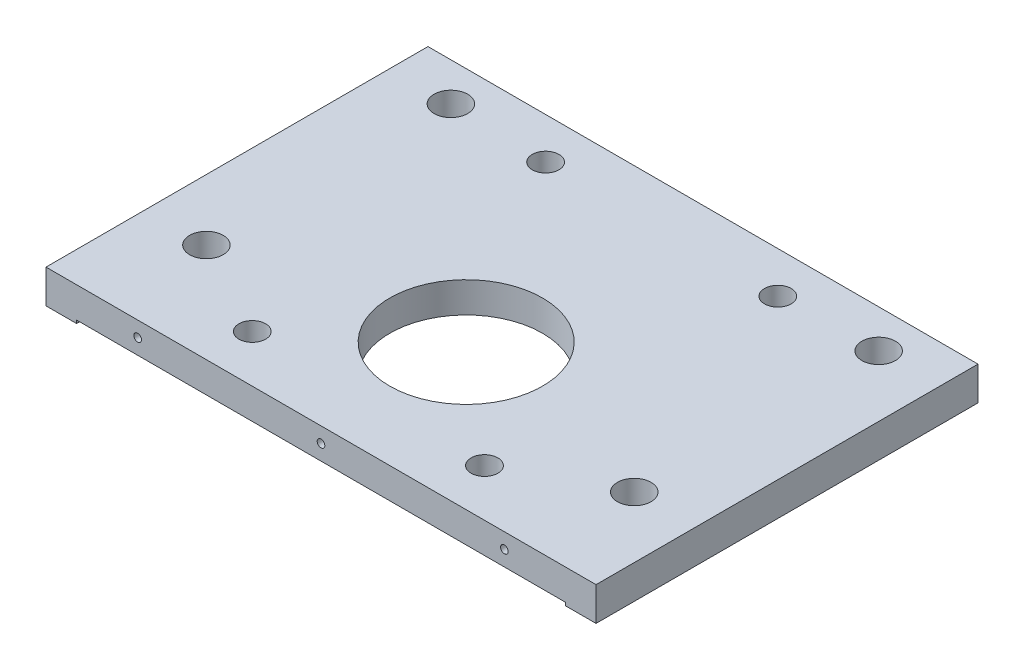
ISO-10303-21;
HEADER;
FILE_DESCRIPTION(('STEP AP214'),'2;1');
FILE_NAME('part.step','',(''),(''),'','','');
FILE_SCHEMA(('AUTOMOTIVE_DESIGN { 1 0 10303 214 1 1 1 1 }'));
ENDSEC;
DATA;
#1=APPLICATION_CONTEXT('core data for automotive mechanical design processes');
#2=APPLICATION_PROTOCOL_DEFINITION('international standard','automotive_design',2000,#1);
#3=PRODUCT_CONTEXT('',#1,'mechanical');
#4=PRODUCT('Part','Part','',(#3));
#5=PRODUCT_RELATED_PRODUCT_CATEGORY('part','',(#4));
#6=PRODUCT_DEFINITION_FORMATION('','',#4);
#7=PRODUCT_DEFINITION_CONTEXT('part definition',#1,'design');
#8=PRODUCT_DEFINITION('design','',#6,#7);
#9=PRODUCT_DEFINITION_SHAPE('','',#8);
#10=(LENGTH_UNIT() NAMED_UNIT(*) SI_UNIT(.MILLI.,.METRE.));
#11=(NAMED_UNIT(*) PLANE_ANGLE_UNIT() SI_UNIT($,.RADIAN.));
#12=(NAMED_UNIT(*) SI_UNIT($,.STERADIAN.) SOLID_ANGLE_UNIT());
#13=UNCERTAINTY_MEASURE_WITH_UNIT(LENGTH_MEASURE(1.E-05),#10,'distance_accuracy_value','');
#14=(GEOMETRIC_REPRESENTATION_CONTEXT(3) GLOBAL_UNCERTAINTY_ASSIGNED_CONTEXT((#13)) GLOBAL_UNIT_ASSIGNED_CONTEXT((#10,
#11,#12)) REPRESENTATION_CONTEXT('',''));
#15=CARTESIAN_POINT('',(0.,0.,0.));
#16=DIRECTION('',(0.,0.,1.));
#17=DIRECTION('',(1.,0.,0.));
#18=AXIS2_PLACEMENT_3D('',#15,#16,#17);
#19=CARTESIAN_POINT('',(0.,22.,0.));
#20=DIRECTION('',(0.,1.,0.));
#21=DIRECTION('',(0.,0.,1.));
#22=AXIS2_PLACEMENT_3D('',#19,#20,#21);
#23=PLANE('',#22);
#24=CARTESIAN_POINT('',(-76.,22.,94.));
#25=DIRECTION('',(0.,-1.,0.));
#26=DIRECTION('',(0.,0.,-1.));
#27=AXIS2_PLACEMENT_3D('',#24,#25,#26);
#28=CIRCLE('',#27,8.74999999999999);
#29=CARTESIAN_POINT('',(-76.,22.,85.25));
#30=VERTEX_POINT('',#29);
#31=EDGE_CURVE('E219',#30,#30,#28,.T.);
#32=ORIENTED_EDGE('',*,*,#31,.T.);
#33=EDGE_LOOP('',(#32));
#34=FACE_BOUND('',#33,.T.);
#35=CARTESIAN_POINT('',(140.,22.,-100.));
#36=DIRECTION('',(0.,1.,0.));
#37=DIRECTION('',(0.,0.,1.));
#38=AXIS2_PLACEMENT_3D('',#35,#36,#37);
#39=CIRCLE('',#38,11.);
#40=CARTESIAN_POINT('',(140.,22.,-89.));
#41=VERTEX_POINT('',#40);
#42=EDGE_CURVE('E50',#41,#41,#39,.F.);
#43=ORIENTED_EDGE('',*,*,#42,.T.);
#44=EDGE_LOOP('',(#43));
#45=FACE_BOUND('',#44,.T.);
#46=CARTESIAN_POINT('',(-140.,22.,-100.));
#47=DIRECTION('',(0.,1.,0.));
#48=DIRECTION('',(0.,0.,1.));
#49=AXIS2_PLACEMENT_3D('',#46,#47,#48);
#50=CIRCLE('',#49,11.);
#51=CARTESIAN_POINT('',(-140.,22.,-89.));
#52=VERTEX_POINT('',#51);
#53=EDGE_CURVE('E320',#52,#52,#50,.F.);
#54=ORIENTED_EDGE('',*,*,#53,.T.);
#55=EDGE_LOOP('',(#54));
#56=FACE_BOUND('',#55,.T.);
#57=CARTESIAN_POINT('',(140.,22.,60.));
#58=DIRECTION('',(0.,1.,0.));
#59=DIRECTION('',(0.,0.,1.));
#60=AXIS2_PLACEMENT_3D('',#57,#58,#59);
#61=CIRCLE('',#60,11.);
#62=CARTESIAN_POINT('',(140.,22.,71.));
#63=VERTEX_POINT('',#62);
#64=EDGE_CURVE('E309',#63,#63,#61,.F.);
#65=ORIENTED_EDGE('',*,*,#64,.T.);
#66=EDGE_LOOP('',(#65));
#67=FACE_BOUND('',#66,.T.);
#68=CARTESIAN_POINT('',(0.,22.,30.));
#69=DIRECTION('',(0.,1.,0.));
#70=DIRECTION('',(0.,0.,1.));
#71=AXIS2_PLACEMENT_3D('',#68,#69,#70);
#72=CIRCLE('',#71,50.);
#73=CARTESIAN_POINT('',(0.,22.,80.));
#74=VERTEX_POINT('',#73);
#75=EDGE_CURVE('E262',#74,#74,#72,.F.);
#76=ORIENTED_EDGE('',*,*,#75,.T.);
#77=EDGE_LOOP('',(#76));
#78=FACE_BOUND('',#77,.T.);
#79=CARTESIAN_POINT('',(-140.,22.,60.));
#80=DIRECTION('',(0.,1.,0.));
#81=DIRECTION('',(0.,0.,1.));
#82=AXIS2_PLACEMENT_3D('',#79,#80,#81);
#83=CIRCLE('',#82,11.);
#84=CARTESIAN_POINT('',(-140.,22.,71.));
#85=VERTEX_POINT('',#84);
#86=EDGE_CURVE('E261',#85,#85,#83,.F.);
#87=ORIENTED_EDGE('',*,*,#86,.T.);
#88=EDGE_LOOP('',(#87));
#89=FACE_BOUND('',#88,.T.);
#90=DIRECTION('',(0.,0.,1.));
#91=VECTOR('',#90,1.);
#92=CARTESIAN_POINT('',(-180.,22.,125.));
#93=LINE('',#92,#91);
#94=CARTESIAN_POINT('',(-180.,22.,-125.));
#95=VERTEX_POINT('',#94);
#96=CARTESIAN_POINT('',(-180.,22.,125.));
#97=VERTEX_POINT('',#96);
#98=EDGE_CURVE('E270',#95,#97,#93,.T.);
#99=ORIENTED_EDGE('',*,*,#98,.T.);
#100=DIRECTION('',(1.,0.,0.));
#101=VECTOR('',#100,1.);
#102=CARTESIAN_POINT('',(180.,22.,125.));
#103=LINE('',#102,#101);
#104=CARTESIAN_POINT('',(180.,22.,125.));
#105=VERTEX_POINT('',#104);
#106=EDGE_CURVE('E95',#97,#105,#103,.T.);
#107=ORIENTED_EDGE('',*,*,#106,.T.);
#108=DIRECTION('',(0.,0.,-1.));
#109=VECTOR('',#108,1.);
#110=CARTESIAN_POINT('',(180.,22.,125.));
#111=LINE('',#110,#109);
#112=CARTESIAN_POINT('',(180.,22.,-125.));
#113=VERTEX_POINT('',#112);
#114=EDGE_CURVE('E276',#105,#113,#111,.T.);
#115=ORIENTED_EDGE('',*,*,#114,.T.);
#116=DIRECTION('',(-1.,0.,0.));
#117=VECTOR('',#116,1.);
#118=CARTESIAN_POINT('',(180.,22.,-125.));
#119=LINE('',#118,#117);
#120=EDGE_CURVE('E66',#113,#95,#119,.T.);
#121=ORIENTED_EDGE('',*,*,#120,.T.);
#122=EDGE_LOOP('',(#99,#107,#115,#121));
#123=FACE_BOUND('',#122,.T.);
#124=CARTESIAN_POINT('',(76.,22.,94.));
#125=DIRECTION('',(0.,-1.,0.));
#126=DIRECTION('',(0.,0.,-1.));
#127=AXIS2_PLACEMENT_3D('',#124,#125,#126);
#128=CIRCLE('',#127,8.74999999999999);
#129=CARTESIAN_POINT('',(76.,22.,85.25));
#130=VERTEX_POINT('',#129);
#131=EDGE_CURVE('E211',#130,#130,#128,.T.);
#132=ORIENTED_EDGE('',*,*,#131,.T.);
#133=EDGE_LOOP('',(#132));
#134=FACE_BOUND('',#133,.T.);
#135=CARTESIAN_POINT('',(-76.,22.,-98.));
#136=DIRECTION('',(0.,-1.,0.));
#137=DIRECTION('',(0.,0.,-1.));
#138=AXIS2_PLACEMENT_3D('',#135,#136,#137);
#139=CIRCLE('',#138,8.74999999999999);
#140=CARTESIAN_POINT('',(-76.,22.,-106.75));
#141=VERTEX_POINT('',#140);
#142=EDGE_CURVE('E204',#141,#141,#139,.T.);
#143=ORIENTED_EDGE('',*,*,#142,.T.);
#144=EDGE_LOOP('',(#143));
#145=FACE_BOUND('',#144,.T.);
#146=CARTESIAN_POINT('',(76.,22.,-98.));
#147=DIRECTION('',(0.,-1.,0.));
#148=DIRECTION('',(0.,0.,-1.));
#149=AXIS2_PLACEMENT_3D('',#146,#147,#148);
#150=CIRCLE('',#149,8.74999999999999);
#151=CARTESIAN_POINT('',(76.,22.,-106.75));
#152=VERTEX_POINT('',#151);
#153=EDGE_CURVE('E196',#152,#152,#150,.T.);
#154=ORIENTED_EDGE('',*,*,#153,.T.);
#155=EDGE_LOOP('',(#154));
#156=FACE_BOUND('',#155,.T.);
#157=ADVANCED_FACE('F41',(#34,#45,#56,#67,#78,#89,#123,#134,#145,#156),#23,.T.);
#158=CARTESIAN_POINT('',(140.,22.001,-100.));
#159=DIRECTION('',(0.,-1.,0.));
#160=DIRECTION('',(0.,0.,-1.));
#161=AXIS2_PLACEMENT_3D('',#158,#159,#160);
#162=CYLINDRICAL_SURFACE('',#161,11.);
#163=ORIENTED_EDGE('',*,*,#42,.F.);
#164=EDGE_LOOP('',(#163));
#165=FACE_BOUND('',#164,.T.);
#166=CARTESIAN_POINT('',(140.,2.,-100.));
#167=DIRECTION('',(0.,-1.,0.));
#168=DIRECTION('',(0.,0.,-1.));
#169=AXIS2_PLACEMENT_3D('',#166,#167,#168);
#170=CIRCLE('',#169,11.);
#171=CARTESIAN_POINT('',(140.,2.,-111.));
#172=VERTEX_POINT('',#171);
#173=EDGE_CURVE('E11',#172,#172,#170,.F.);
#174=ORIENTED_EDGE('',*,*,#173,.F.);
#175=EDGE_LOOP('',(#174));
#176=FACE_BOUND('',#175,.T.);
#177=ADVANCED_FACE('F43',(#165,#176),#162,.F.);
#178=CARTESIAN_POINT('',(-140.,22.001,-100.));
#179=DIRECTION('',(0.,-1.,0.));
#180=DIRECTION('',(0.,0.,-1.));
#181=AXIS2_PLACEMENT_3D('',#178,#179,#180);
#182=CYLINDRICAL_SURFACE('',#181,11.);
#183=ORIENTED_EDGE('',*,*,#53,.F.);
#184=EDGE_LOOP('',(#183));
#185=FACE_BOUND('',#184,.T.);
#186=CARTESIAN_POINT('',(-140.,2.,-100.));
#187=DIRECTION('',(0.,-1.,0.));
#188=DIRECTION('',(0.,0.,-1.));
#189=AXIS2_PLACEMENT_3D('',#186,#187,#188);
#190=CIRCLE('',#189,11.);
#191=CARTESIAN_POINT('',(-140.,2.,-111.));
#192=VERTEX_POINT('',#191);
#193=EDGE_CURVE('E324',#192,#192,#190,.F.);
#194=ORIENTED_EDGE('',*,*,#193,.F.);
#195=EDGE_LOOP('',(#194));
#196=FACE_BOUND('',#195,.T.);
#197=ADVANCED_FACE('F334',(#185,#196),#182,.F.);
#198=CARTESIAN_POINT('',(140.,22.001,60.));
#199=DIRECTION('',(0.,-1.,0.));
#200=DIRECTION('',(0.,0.,-1.));
#201=AXIS2_PLACEMENT_3D('',#198,#199,#200);
#202=CYLINDRICAL_SURFACE('',#201,11.);
#203=ORIENTED_EDGE('',*,*,#64,.F.);
#204=EDGE_LOOP('',(#203));
#205=FACE_BOUND('',#204,.T.);
#206=CARTESIAN_POINT('',(140.,2.,60.));
#207=DIRECTION('',(0.,-1.,0.));
#208=DIRECTION('',(0.,0.,-1.));
#209=AXIS2_PLACEMENT_3D('',#206,#207,#208);
#210=CIRCLE('',#209,11.);
#211=CARTESIAN_POINT('',(140.,2.,49.));
#212=VERTEX_POINT('',#211);
#213=EDGE_CURVE('E316',#212,#212,#210,.F.);
#214=ORIENTED_EDGE('',*,*,#213,.F.);
#215=EDGE_LOOP('',(#214));
#216=FACE_BOUND('',#215,.T.);
#217=ADVANCED_FACE('F367',(#205,#216),#202,.F.);
#218=CARTESIAN_POINT('',(0.,0.,0.));
#219=DIRECTION('',(0.,1.,0.));
#220=DIRECTION('',(0.,0.,1.));
#221=AXIS2_PLACEMENT_3D('',#218,#219,#220);
#222=PLANE('',#221);
#223=DIRECTION('',(1.,0.,0.));
#224=VECTOR('',#223,1.);
#225=CARTESIAN_POINT('',(180.,0.,125.));
#226=LINE('',#225,#224);
#227=CARTESIAN_POINT('',(160.,0.,125.));
#228=VERTEX_POINT('',#227);
#229=CARTESIAN_POINT('',(180.,0.,125.));
#230=VERTEX_POINT('',#229);
#231=EDGE_CURVE('E285',#228,#230,#226,.T.);
#232=ORIENTED_EDGE('',*,*,#231,.F.);
#233=DIRECTION('',(0.,0.,1.));
#234=VECTOR('',#233,1.);
#235=CARTESIAN_POINT('',(160.,0.,-125.));
#236=LINE('',#235,#234);
#237=CARTESIAN_POINT('',(160.,0.,-125.));
#238=VERTEX_POINT('',#237);
#239=EDGE_CURVE('E229',#238,#228,#236,.T.);
#240=ORIENTED_EDGE('',*,*,#239,.F.);
#241=DIRECTION('',(-1.,0.,0.));
#242=VECTOR('',#241,1.);
#243=CARTESIAN_POINT('',(180.,0.,-125.));
#244=LINE('',#243,#242);
#245=CARTESIAN_POINT('',(180.,0.,-125.));
#246=VERTEX_POINT('',#245);
#247=EDGE_CURVE('E273',#246,#238,#244,.T.);
#248=ORIENTED_EDGE('',*,*,#247,.F.);
#249=DIRECTION('',(0.,0.,-1.));
#250=VECTOR('',#249,1.);
#251=CARTESIAN_POINT('',(180.,0.,125.));
#252=LINE('',#251,#250);
#253=EDGE_CURVE('E290',#230,#246,#252,.T.);
#254=ORIENTED_EDGE('',*,*,#253,.F.);
#255=EDGE_LOOP('',(#232,#240,#248,#254));
#256=FACE_BOUND('',#255,.T.);
#257=ADVANCED_FACE('F357',(#256),#222,.F.);
#258=CARTESIAN_POINT('',(-140.,22.001,60.));
#259=DIRECTION('',(0.,-1.,0.));
#260=DIRECTION('',(0.,0.,-1.));
#261=AXIS2_PLACEMENT_3D('',#258,#259,#260);
#262=CYLINDRICAL_SURFACE('',#261,11.);
#263=ORIENTED_EDGE('',*,*,#86,.F.);
#264=EDGE_LOOP('',(#263));
#265=FACE_BOUND('',#264,.T.);
#266=CARTESIAN_POINT('',(-140.,2.,60.));
#267=DIRECTION('',(0.,-1.,0.));
#268=DIRECTION('',(0.,0.,-1.));
#269=AXIS2_PLACEMENT_3D('',#266,#267,#268);
#270=CIRCLE('',#269,11.);
#271=CARTESIAN_POINT('',(-140.,2.,49.));
#272=VERTEX_POINT('',#271);
#273=EDGE_CURVE('E257',#272,#272,#270,.F.);
#274=ORIENTED_EDGE('',*,*,#273,.F.);
#275=EDGE_LOOP('',(#274));
#276=FACE_BOUND('',#275,.T.);
#277=ADVANCED_FACE('F354',(#265,#276),#262,.F.);
#278=CARTESIAN_POINT('',(0.,22.001,30.));
#279=DIRECTION('',(0.,-1.,0.));
#280=DIRECTION('',(0.,0.,-1.));
#281=AXIS2_PLACEMENT_3D('',#278,#279,#280);
#282=CYLINDRICAL_SURFACE('',#281,50.);
#283=ORIENTED_EDGE('',*,*,#75,.F.);
#284=EDGE_LOOP('',(#283));
#285=FACE_BOUND('',#284,.T.);
#286=CARTESIAN_POINT('',(0.,2.,30.));
#287=DIRECTION('',(0.,-1.,0.));
#288=DIRECTION('',(0.,0.,-1.));
#289=AXIS2_PLACEMENT_3D('',#286,#287,#288);
#290=CIRCLE('',#289,50.);
#291=CARTESIAN_POINT('',(0.,2.,-20.));
#292=VERTEX_POINT('',#291);
#293=EDGE_CURVE('E248',#292,#292,#290,.F.);
#294=ORIENTED_EDGE('',*,*,#293,.F.);
#295=EDGE_LOOP('',(#294));
#296=FACE_BOUND('',#295,.T.);
#297=ADVANCED_FACE('F356',(#285,#296),#282,.F.);
#298=CARTESIAN_POINT('',(-180.,22.,125.));
#299=DIRECTION('',(1.,0.,0.));
#300=DIRECTION('',(0.,0.,-1.));
#301=AXIS2_PLACEMENT_3D('',#298,#299,#300);
#302=PLANE('',#301);
#303=DIRECTION('',(0.,0.,1.));
#304=VECTOR('',#303,1.);
#305=CARTESIAN_POINT('',(-180.,0.,125.));
#306=LINE('',#305,#304);
#307=CARTESIAN_POINT('',(-180.,0.,-125.));
#308=VERTEX_POINT('',#307);
#309=CARTESIAN_POINT('',(-180.,0.,125.));
#310=VERTEX_POINT('',#309);
#311=EDGE_CURVE('E266',#308,#310,#306,.T.);
#312=ORIENTED_EDGE('',*,*,#311,.T.);
#313=DIRECTION('',(0.,-1.,0.));
#314=VECTOR('',#313,1.);
#315=CARTESIAN_POINT('',(-180.,22.,125.));
#316=LINE('',#315,#314);
#317=EDGE_CURVE('E306',#97,#310,#316,.T.);
#318=ORIENTED_EDGE('',*,*,#317,.F.);
#319=ORIENTED_EDGE('',*,*,#98,.F.);
#320=DIRECTION('',(0.,-1.,0.));
#321=VECTOR('',#320,1.);
#322=CARTESIAN_POINT('',(-180.,22.,-125.));
#323=LINE('',#322,#321);
#324=EDGE_CURVE('E281',#95,#308,#323,.T.);
#325=ORIENTED_EDGE('',*,*,#324,.T.);
#326=EDGE_LOOP('',(#312,#318,#319,#325));
#327=FACE_BOUND('',#326,.T.);
#328=ADVANCED_FACE('F364',(#327),#302,.F.);
#329=CARTESIAN_POINT('',(180.,22.,125.));
#330=DIRECTION('',(0.,0.,-1.));
#331=DIRECTION('',(-1.,0.,0.));
#332=AXIS2_PLACEMENT_3D('',#329,#330,#331);
#333=PLANE('',#332);
#334=CARTESIAN_POINT('',(120.,12.,125.));
#335=DIRECTION('',(0.,0.,1.));
#336=DIRECTION('',(1.,0.,0.));
#337=AXIS2_PLACEMENT_3D('',#334,#335,#336);
#338=CIRCLE('',#337,2.49999999999999);
#339=CARTESIAN_POINT('',(122.5,12.,125.));
#340=VERTEX_POINT('',#339);
#341=EDGE_CURVE('E145',#340,#340,#338,.T.);
#342=ORIENTED_EDGE('',*,*,#341,.F.);
#343=EDGE_LOOP('',(#342));
#344=FACE_BOUND('',#343,.T.);
#345=CARTESIAN_POINT('',(0.,12.,125.));
#346=DIRECTION('',(0.,0.,1.));
#347=DIRECTION('',(1.,0.,0.));
#348=AXIS2_PLACEMENT_3D('',#345,#346,#347);
#349=CIRCLE('',#348,2.49999999999999);
#350=CARTESIAN_POINT('',(2.49999999999997,12.,125.));
#351=VERTEX_POINT('',#350);
#352=EDGE_CURVE('E144',#351,#351,#349,.T.);
#353=ORIENTED_EDGE('',*,*,#352,.F.);
#354=EDGE_LOOP('',(#353));
#355=FACE_BOUND('',#354,.T.);
#356=CARTESIAN_POINT('',(-120.,12.,125.));
#357=DIRECTION('',(0.,0.,1.));
#358=DIRECTION('',(1.,0.,0.));
#359=AXIS2_PLACEMENT_3D('',#356,#357,#358);
#360=CIRCLE('',#359,2.49999999999999);
#361=CARTESIAN_POINT('',(-117.5,12.,125.));
#362=VERTEX_POINT('',#361);
#363=EDGE_CURVE('E160',#362,#362,#360,.T.);
#364=ORIENTED_EDGE('',*,*,#363,.F.);
#365=EDGE_LOOP('',(#364));
#366=FACE_BOUND('',#365,.T.);
#367=DIRECTION('',(-1.,0.,0.));
#368=VECTOR('',#367,1.);
#369=CARTESIAN_POINT('',(160.,2.,125.));
#370=LINE('',#369,#368);
#371=CARTESIAN_POINT('',(160.,2.,125.));
#372=VERTEX_POINT('',#371);
#373=CARTESIAN_POINT('',(-160.,2.,125.));
#374=VERTEX_POINT('',#373);
#375=EDGE_CURVE('E224',#372,#374,#370,.T.);
#376=ORIENTED_EDGE('',*,*,#375,.F.);
#377=DIRECTION('',(0.,-1.,0.));
#378=VECTOR('',#377,1.);
#379=CARTESIAN_POINT('',(160.,2.,125.));
#380=LINE('',#379,#378);
#381=EDGE_CURVE('E244',#372,#228,#380,.T.);
#382=ORIENTED_EDGE('',*,*,#381,.T.);
#383=ORIENTED_EDGE('',*,*,#231,.T.);
#384=DIRECTION('',(0.,-1.,0.));
#385=VECTOR('',#384,1.);
#386=CARTESIAN_POINT('',(180.,22.,125.));
#387=LINE('',#386,#385);
#388=EDGE_CURVE('E302',#105,#230,#387,.T.);
#389=ORIENTED_EDGE('',*,*,#388,.F.);
#390=ORIENTED_EDGE('',*,*,#106,.F.);
#391=ORIENTED_EDGE('',*,*,#317,.T.);
#392=CARTESIAN_POINT('',(-160.,0.,125.));
#393=VERTEX_POINT('',#392);
#394=EDGE_CURVE('E286',#310,#393,#226,.T.);
#395=ORIENTED_EDGE('',*,*,#394,.T.);
#396=DIRECTION('',(0.,-1.,0.));
#397=VECTOR('',#396,1.);
#398=CARTESIAN_POINT('',(-160.,2.,125.));
#399=LINE('',#398,#397);
#400=EDGE_CURVE('E57',#374,#393,#399,.T.);
#401=ORIENTED_EDGE('',*,*,#400,.F.);
#402=EDGE_LOOP('',(#376,#382,#383,#389,#390,#391,#395,#401));
#403=FACE_BOUND('',#402,.T.);
#404=ADVANCED_FACE('F386',(#344,#355,#366,#403),#333,.F.);
#405=CARTESIAN_POINT('',(180.,22.,125.));
#406=DIRECTION('',(-1.,0.,0.));
#407=DIRECTION('',(0.,0.,1.));
#408=AXIS2_PLACEMENT_3D('',#405,#406,#407);
#409=PLANE('',#408);
#410=ORIENTED_EDGE('',*,*,#253,.T.);
#411=DIRECTION('',(0.,-1.,0.));
#412=VECTOR('',#411,1.);
#413=CARTESIAN_POINT('',(180.,22.,-125.));
#414=LINE('',#413,#412);
#415=EDGE_CURVE('E298',#113,#246,#414,.T.);
#416=ORIENTED_EDGE('',*,*,#415,.F.);
#417=ORIENTED_EDGE('',*,*,#114,.F.);
#418=ORIENTED_EDGE('',*,*,#388,.T.);
#419=EDGE_LOOP('',(#410,#416,#417,#418));
#420=FACE_BOUND('',#419,.T.);
#421=ADVANCED_FACE('F382',(#420),#409,.F.);
#422=CARTESIAN_POINT('',(180.,22.,-125.));
#423=DIRECTION('',(0.,0.,1.));
#424=DIRECTION('',(1.,0.,0.));
#425=AXIS2_PLACEMENT_3D('',#422,#423,#424);
#426=PLANE('',#425);
#427=CARTESIAN_POINT('',(120.,12.,-125.));
#428=DIRECTION('',(0.,0.,-1.));
#429=DIRECTION('',(-1.,0.,0.));
#430=AXIS2_PLACEMENT_3D('',#427,#428,#429);
#431=CIRCLE('',#430,2.49999999999999);
#432=CARTESIAN_POINT('',(117.5,12.,-125.));
#433=VERTEX_POINT('',#432);
#434=EDGE_CURVE('E168',#433,#433,#431,.T.);
#435=ORIENTED_EDGE('',*,*,#434,.F.);
#436=EDGE_LOOP('',(#435));
#437=FACE_BOUND('',#436,.T.);
#438=CARTESIAN_POINT('',(0.,12.,-125.));
#439=DIRECTION('',(0.,0.,-1.));
#440=DIRECTION('',(-1.,0.,0.));
#441=AXIS2_PLACEMENT_3D('',#438,#439,#440);
#442=CIRCLE('',#441,2.49999999999999);
#443=CARTESIAN_POINT('',(-2.50000000000001,12.,-125.));
#444=VERTEX_POINT('',#443);
#445=EDGE_CURVE('E176',#444,#444,#442,.T.);
#446=ORIENTED_EDGE('',*,*,#445,.F.);
#447=EDGE_LOOP('',(#446));
#448=FACE_BOUND('',#447,.T.);
#449=CARTESIAN_POINT('',(-120.,12.,-125.));
#450=DIRECTION('',(0.,0.,-1.));
#451=DIRECTION('',(-1.,0.,0.));
#452=AXIS2_PLACEMENT_3D('',#449,#450,#451);
#453=CIRCLE('',#452,2.49999999999999);
#454=CARTESIAN_POINT('',(-122.5,12.,-125.));
#455=VERTEX_POINT('',#454);
#456=EDGE_CURVE('E184',#455,#455,#453,.T.);
#457=ORIENTED_EDGE('',*,*,#456,.F.);
#458=EDGE_LOOP('',(#457));
#459=FACE_BOUND('',#458,.T.);
#460=ORIENTED_EDGE('',*,*,#247,.T.);
#461=DIRECTION('',(0.,-1.,0.));
#462=VECTOR('',#461,1.);
#463=CARTESIAN_POINT('',(160.,2.,-125.));
#464=LINE('',#463,#462);
#465=CARTESIAN_POINT('',(160.,2.,-125.));
#466=VERTEX_POINT('',#465);
#467=EDGE_CURVE('E249',#466,#238,#464,.T.);
#468=ORIENTED_EDGE('',*,*,#467,.F.);
#469=DIRECTION('',(1.,0.,0.));
#470=VECTOR('',#469,1.);
#471=CARTESIAN_POINT('',(-160.,2.,-125.));
#472=LINE('',#471,#470);
#473=CARTESIAN_POINT('',(-160.,2.,-125.));
#474=VERTEX_POINT('',#473);
#475=EDGE_CURVE('E233',#474,#466,#472,.T.);
#476=ORIENTED_EDGE('',*,*,#475,.F.);
#477=DIRECTION('',(0.,-1.,0.));
#478=VECTOR('',#477,1.);
#479=CARTESIAN_POINT('',(-160.,2.,-125.));
#480=LINE('',#479,#478);
#481=CARTESIAN_POINT('',(-160.,0.,-125.));
#482=VERTEX_POINT('',#481);
#483=EDGE_CURVE('E252',#474,#482,#480,.T.);
#484=ORIENTED_EDGE('',*,*,#483,.T.);
#485=EDGE_CURVE('E87',#482,#308,#244,.T.);
#486=ORIENTED_EDGE('',*,*,#485,.T.);
#487=ORIENTED_EDGE('',*,*,#324,.F.);
#488=ORIENTED_EDGE('',*,*,#120,.F.);
#489=ORIENTED_EDGE('',*,*,#415,.T.);
#490=EDGE_LOOP('',(#460,#468,#476,#484,#486,#487,#488,#489));
#491=FACE_BOUND('',#490,.T.);
#492=ADVANCED_FACE('F378',(#437,#448,#459,#491),#426,.F.);
#493=ORIENTED_EDGE('',*,*,#485,.F.);
#494=DIRECTION('',(0.,0.,-1.));
#495=VECTOR('',#494,1.);
#496=CARTESIAN_POINT('',(-160.,0.,125.));
#497=LINE('',#496,#495);
#498=EDGE_CURVE('E223',#393,#482,#497,.T.);
#499=ORIENTED_EDGE('',*,*,#498,.F.);
#500=ORIENTED_EDGE('',*,*,#394,.F.);
#501=ORIENTED_EDGE('',*,*,#311,.F.);
#502=EDGE_LOOP('',(#493,#499,#500,#501));
#503=FACE_BOUND('',#502,.T.);
#504=ADVANCED_FACE('F341',(#503),#222,.F.);
#505=CARTESIAN_POINT('',(0.,2.,0.));
#506=DIRECTION('',(0.,-1.,0.));
#507=DIRECTION('',(0.,0.,-1.));
#508=AXIS2_PLACEMENT_3D('',#505,#506,#507);
#509=PLANE('',#508);
#510=CARTESIAN_POINT('',(76.,2.,-98.));
#511=DIRECTION('',(0.,-1.,0.));
#512=DIRECTION('',(0.,0.,-1.));
#513=AXIS2_PLACEMENT_3D('',#510,#511,#512);
#514=CIRCLE('',#513,8.75000000000001);
#515=CARTESIAN_POINT('',(76.,2.,-106.75));
#516=VERTEX_POINT('',#515);
#517=EDGE_CURVE('E192',#516,#516,#514,.T.);
#518=ORIENTED_EDGE('',*,*,#517,.F.);
#519=EDGE_LOOP('',(#518));
#520=FACE_BOUND('',#519,.T.);
#521=CARTESIAN_POINT('',(-76.,2.,-98.));
#522=DIRECTION('',(0.,-1.,0.));
#523=DIRECTION('',(0.,0.,-1.));
#524=AXIS2_PLACEMENT_3D('',#521,#522,#523);
#525=CIRCLE('',#524,8.75000000000001);
#526=CARTESIAN_POINT('',(-76.,2.,-106.75));
#527=VERTEX_POINT('',#526);
#528=EDGE_CURVE('E200',#527,#527,#525,.T.);
#529=ORIENTED_EDGE('',*,*,#528,.F.);
#530=EDGE_LOOP('',(#529));
#531=FACE_BOUND('',#530,.T.);
#532=CARTESIAN_POINT('',(76.,2.,94.));
#533=DIRECTION('',(0.,-1.,0.));
#534=DIRECTION('',(0.,0.,-1.));
#535=AXIS2_PLACEMENT_3D('',#532,#533,#534);
#536=CIRCLE('',#535,8.75000000000001);
#537=CARTESIAN_POINT('',(76.,2.,85.25));
#538=VERTEX_POINT('',#537);
#539=EDGE_CURVE('E208',#538,#538,#536,.T.);
#540=ORIENTED_EDGE('',*,*,#539,.F.);
#541=EDGE_LOOP('',(#540));
#542=FACE_BOUND('',#541,.T.);
#543=CARTESIAN_POINT('',(-76.,2.,94.));
#544=DIRECTION('',(0.,-1.,0.));
#545=DIRECTION('',(0.,0.,-1.));
#546=AXIS2_PLACEMENT_3D('',#543,#544,#545);
#547=CIRCLE('',#546,8.75000000000001);
#548=CARTESIAN_POINT('',(-76.,2.,85.25));
#549=VERTEX_POINT('',#548);
#550=EDGE_CURVE('E215',#549,#549,#547,.T.);
#551=ORIENTED_EDGE('',*,*,#550,.F.);
#552=EDGE_LOOP('',(#551));
#553=FACE_BOUND('',#552,.T.);
#554=ORIENTED_EDGE('',*,*,#173,.T.);
#555=EDGE_LOOP('',(#554));
#556=FACE_BOUND('',#555,.T.);
#557=ORIENTED_EDGE('',*,*,#193,.T.);
#558=EDGE_LOOP('',(#557));
#559=FACE_BOUND('',#558,.T.);
#560=ORIENTED_EDGE('',*,*,#213,.T.);
#561=EDGE_LOOP('',(#560));
#562=FACE_BOUND('',#561,.T.);
#563=ORIENTED_EDGE('',*,*,#375,.T.);
#564=DIRECTION('',(0.,0.,-1.));
#565=VECTOR('',#564,1.);
#566=CARTESIAN_POINT('',(-160.,2.,125.));
#567=LINE('',#566,#565);
#568=EDGE_CURVE('E228',#374,#474,#567,.T.);
#569=ORIENTED_EDGE('',*,*,#568,.T.);
#570=ORIENTED_EDGE('',*,*,#475,.T.);
#571=DIRECTION('',(0.,0.,1.));
#572=VECTOR('',#571,1.);
#573=CARTESIAN_POINT('',(160.,2.,-125.));
#574=LINE('',#573,#572);
#575=EDGE_CURVE('E236',#466,#372,#574,.T.);
#576=ORIENTED_EDGE('',*,*,#575,.T.);
#577=EDGE_LOOP('',(#563,#569,#570,#576));
#578=FACE_BOUND('',#577,.T.);
#579=ORIENTED_EDGE('',*,*,#293,.T.);
#580=EDGE_LOOP('',(#579));
#581=FACE_BOUND('',#580,.T.);
#582=ORIENTED_EDGE('',*,*,#273,.T.);
#583=EDGE_LOOP('',(#582));
#584=FACE_BOUND('',#583,.T.);
#585=ADVANCED_FACE('F337',(#520,#531,#542,#553,#556,#559,#562,#578,#581,#584),#509,.T.);
#586=CARTESIAN_POINT('',(160.,2.,-125.));
#587=DIRECTION('',(1.,0.,0.));
#588=DIRECTION('',(0.,0.,-1.));
#589=AXIS2_PLACEMENT_3D('',#586,#587,#588);
#590=PLANE('',#589);
#591=ORIENTED_EDGE('',*,*,#239,.T.);
#592=ORIENTED_EDGE('',*,*,#381,.F.);
#593=ORIENTED_EDGE('',*,*,#575,.F.);
#594=ORIENTED_EDGE('',*,*,#467,.T.);
#595=EDGE_LOOP('',(#591,#592,#593,#594));
#596=FACE_BOUND('',#595,.T.);
#597=ADVANCED_FACE('F340',(#596),#590,.F.);
#598=CARTESIAN_POINT('',(-160.,2.,125.));
#599=DIRECTION('',(-1.,0.,0.));
#600=DIRECTION('',(0.,0.,1.));
#601=AXIS2_PLACEMENT_3D('',#598,#599,#600);
#602=PLANE('',#601);
#603=ORIENTED_EDGE('',*,*,#498,.T.);
#604=ORIENTED_EDGE('',*,*,#483,.F.);
#605=ORIENTED_EDGE('',*,*,#568,.F.);
#606=ORIENTED_EDGE('',*,*,#400,.T.);
#607=EDGE_LOOP('',(#603,#604,#605,#606));
#608=FACE_BOUND('',#607,.T.);
#609=ADVANCED_FACE('F433',(#608),#602,.F.);
#610=CARTESIAN_POINT('',(-76.,2.,94.));
#611=DIRECTION('',(0.,-1.,0.));
#612=DIRECTION('',(0.,0.,-1.));
#613=AXIS2_PLACEMENT_3D('',#610,#611,#612);
#614=CYLINDRICAL_SURFACE('',#613,8.75);
#615=ORIENTED_EDGE('',*,*,#31,.F.);
#616=EDGE_LOOP('',(#615));
#617=FACE_BOUND('',#616,.T.);
#618=ORIENTED_EDGE('',*,*,#550,.T.);
#619=EDGE_LOOP('',(#618));
#620=FACE_BOUND('',#619,.T.);
#621=ADVANCED_FACE('F430',(#617,#620),#614,.F.);
#622=CARTESIAN_POINT('',(76.,2.,94.));
#623=DIRECTION('',(0.,-1.,0.));
#624=DIRECTION('',(0.,0.,-1.));
#625=AXIS2_PLACEMENT_3D('',#622,#623,#624);
#626=CYLINDRICAL_SURFACE('',#625,8.75);
#627=ORIENTED_EDGE('',*,*,#131,.F.);
#628=EDGE_LOOP('',(#627));
#629=FACE_BOUND('',#628,.T.);
#630=ORIENTED_EDGE('',*,*,#539,.T.);
#631=EDGE_LOOP('',(#630));
#632=FACE_BOUND('',#631,.T.);
#633=ADVANCED_FACE('F432',(#629,#632),#626,.F.);
#634=CARTESIAN_POINT('',(-76.,2.,-98.));
#635=DIRECTION('',(0.,-1.,0.));
#636=DIRECTION('',(0.,0.,-1.));
#637=AXIS2_PLACEMENT_3D('',#634,#635,#636);
#638=CYLINDRICAL_SURFACE('',#637,8.75);
#639=ORIENTED_EDGE('',*,*,#142,.F.);
#640=EDGE_LOOP('',(#639));
#641=FACE_BOUND('',#640,.T.);
#642=ORIENTED_EDGE('',*,*,#528,.T.);
#643=EDGE_LOOP('',(#642));
#644=FACE_BOUND('',#643,.T.);
#645=ADVANCED_FACE('F420',(#641,#644),#638,.F.);
#646=CARTESIAN_POINT('',(76.,2.,-98.));
#647=DIRECTION('',(0.,-1.,0.));
#648=DIRECTION('',(0.,0.,-1.));
#649=AXIS2_PLACEMENT_3D('',#646,#647,#648);
#650=CYLINDRICAL_SURFACE('',#649,8.75);
#651=ORIENTED_EDGE('',*,*,#153,.F.);
#652=EDGE_LOOP('',(#651));
#653=FACE_BOUND('',#652,.T.);
#654=ORIENTED_EDGE('',*,*,#517,.T.);
#655=EDGE_LOOP('',(#654));
#656=FACE_BOUND('',#655,.T.);
#657=ADVANCED_FACE('F416',(#653,#656),#650,.F.);
#658=CARTESIAN_POINT('',(-120.,12.,-110.));
#659=DIRECTION('',(0.,0.,-1.));
#660=DIRECTION('',(-1.,0.,0.));
#661=AXIS2_PLACEMENT_3D('',#658,#659,#660);
#662=CONICAL_SURFACE('',#661,2.49999999999999,1.02974425867665);
#663=CARTESIAN_POINT('',(-120.,12.,-108.497848452431));
#664=VERTEX_POINT('',#663);
#665=VERTEX_LOOP('',#664);
#666=FACE_BOUND('',#665,.T.);
#667=CARTESIAN_POINT('',(-120.,12.,-110.));
#668=DIRECTION('',(0.,0.,-1.));
#669=DIRECTION('',(-1.,0.,0.));
#670=AXIS2_PLACEMENT_3D('',#667,#668,#669);
#671=CIRCLE('',#670,2.49999999999999);
#672=CARTESIAN_POINT('',(-122.5,12.,-110.));
#673=VERTEX_POINT('',#672);
#674=EDGE_CURVE('E188',#673,#673,#671,.T.);
#675=ORIENTED_EDGE('',*,*,#674,.T.);
#676=EDGE_LOOP('',(#675));
#677=FACE_BOUND('',#676,.T.);
#678=ADVANCED_FACE('F419',(#666,#677),#662,.F.);
#679=CARTESIAN_POINT('',(-120.,12.,-125.));
#680=DIRECTION('',(0.,0.,-1.));
#681=DIRECTION('',(-1.,0.,0.));
#682=AXIS2_PLACEMENT_3D('',#679,#680,#681);
#683=CYLINDRICAL_SURFACE('',#682,2.49999999999999);
#684=ORIENTED_EDGE('',*,*,#674,.F.);
#685=EDGE_LOOP('',(#684));
#686=FACE_BOUND('',#685,.T.);
#687=ORIENTED_EDGE('',*,*,#456,.T.);
#688=EDGE_LOOP('',(#687));
#689=FACE_BOUND('',#688,.T.);
#690=ADVANCED_FACE('F496',(#686,#689),#683,.F.);
#691=CARTESIAN_POINT('',(0.,12.,-110.));
#692=DIRECTION('',(0.,0.,-1.));
#693=DIRECTION('',(-1.,0.,0.));
#694=AXIS2_PLACEMENT_3D('',#691,#692,#693);
#695=CONICAL_SURFACE('',#694,2.49999999999999,1.02974425867665);
#696=CARTESIAN_POINT('',(0.,12.,-108.497848452431));
#697=VERTEX_POINT('',#696);
#698=VERTEX_LOOP('',#697);
#699=FACE_BOUND('',#698,.T.);
#700=CARTESIAN_POINT('',(0.,12.,-110.));
#701=DIRECTION('',(0.,0.,-1.));
#702=DIRECTION('',(-1.,0.,0.));
#703=AXIS2_PLACEMENT_3D('',#700,#701,#702);
#704=CIRCLE('',#703,2.49999999999999);
#705=CARTESIAN_POINT('',(-2.50000000000002,12.,-110.));
#706=VERTEX_POINT('',#705);
#707=EDGE_CURVE('E180',#706,#706,#704,.T.);
#708=ORIENTED_EDGE('',*,*,#707,.T.);
#709=EDGE_LOOP('',(#708));
#710=FACE_BOUND('',#709,.T.);
#711=ADVANCED_FACE('F506',(#699,#710),#695,.F.);
#712=CARTESIAN_POINT('',(0.,12.,-125.));
#713=DIRECTION('',(0.,0.,-1.));
#714=DIRECTION('',(-1.,0.,0.));
#715=AXIS2_PLACEMENT_3D('',#712,#713,#714);
#716=CYLINDRICAL_SURFACE('',#715,2.49999999999999);
#717=ORIENTED_EDGE('',*,*,#707,.F.);
#718=EDGE_LOOP('',(#717));
#719=FACE_BOUND('',#718,.T.);
#720=ORIENTED_EDGE('',*,*,#445,.T.);
#721=EDGE_LOOP('',(#720));
#722=FACE_BOUND('',#721,.T.);
#723=ADVANCED_FACE('F515',(#719,#722),#716,.F.);
#724=CARTESIAN_POINT('',(120.,12.,-110.));
#725=DIRECTION('',(0.,0.,-1.));
#726=DIRECTION('',(-1.,0.,0.));
#727=AXIS2_PLACEMENT_3D('',#724,#725,#726);
#728=CONICAL_SURFACE('',#727,2.49999999999999,1.02974425867665);
#729=CARTESIAN_POINT('',(120.,12.,-108.497848452431));
#730=VERTEX_POINT('',#729);
#731=VERTEX_LOOP('',#730);
#732=FACE_BOUND('',#731,.T.);
#733=CARTESIAN_POINT('',(120.,12.,-110.));
#734=DIRECTION('',(0.,0.,-1.));
#735=DIRECTION('',(-1.,0.,0.));
#736=AXIS2_PLACEMENT_3D('',#733,#734,#735);
#737=CIRCLE('',#736,2.49999999999999);
#738=CARTESIAN_POINT('',(117.5,12.,-110.));
#739=VERTEX_POINT('',#738);
#740=EDGE_CURVE('E172',#739,#739,#737,.T.);
#741=ORIENTED_EDGE('',*,*,#740,.T.);
#742=EDGE_LOOP('',(#741));
#743=FACE_BOUND('',#742,.T.);
#744=ADVANCED_FACE('F524',(#732,#743),#728,.F.);
#745=CARTESIAN_POINT('',(120.,12.,-125.));
#746=DIRECTION('',(0.,0.,-1.));
#747=DIRECTION('',(-1.,0.,0.));
#748=AXIS2_PLACEMENT_3D('',#745,#746,#747);
#749=CYLINDRICAL_SURFACE('',#748,2.49999999999999);
#750=ORIENTED_EDGE('',*,*,#740,.F.);
#751=EDGE_LOOP('',(#750));
#752=FACE_BOUND('',#751,.T.);
#753=ORIENTED_EDGE('',*,*,#434,.T.);
#754=EDGE_LOOP('',(#753));
#755=FACE_BOUND('',#754,.T.);
#756=ADVANCED_FACE('F533',(#752,#755),#749,.F.);
#757=CARTESIAN_POINT('',(-120.,12.,110.));
#758=DIRECTION('',(0.,0.,1.));
#759=DIRECTION('',(1.,0.,0.));
#760=AXIS2_PLACEMENT_3D('',#757,#758,#759);
#761=CONICAL_SURFACE('',#760,2.49999999999999,1.02974425867665);
#762=CARTESIAN_POINT('',(-120.,12.,108.497848452431));
#763=VERTEX_POINT('',#762);
#764=VERTEX_LOOP('',#763);
#765=FACE_BOUND('',#764,.T.);
#766=CARTESIAN_POINT('',(-120.,12.,110.));
#767=DIRECTION('',(0.,0.,1.));
#768=DIRECTION('',(1.,0.,0.));
#769=AXIS2_PLACEMENT_3D('',#766,#767,#768);
#770=CIRCLE('',#769,2.49999999999999);
#771=CARTESIAN_POINT('',(-117.5,12.,110.));
#772=VERTEX_POINT('',#771);
#773=EDGE_CURVE('E164',#772,#772,#770,.T.);
#774=ORIENTED_EDGE('',*,*,#773,.T.);
#775=EDGE_LOOP('',(#774));
#776=FACE_BOUND('',#775,.T.);
#777=ADVANCED_FACE('F542',(#765,#776),#761,.F.);
#778=CARTESIAN_POINT('',(-120.,12.,125.));
#779=DIRECTION('',(0.,0.,1.));
#780=DIRECTION('',(1.,0.,0.));
#781=AXIS2_PLACEMENT_3D('',#778,#779,#780);
#782=CYLINDRICAL_SURFACE('',#781,2.49999999999999);
#783=ORIENTED_EDGE('',*,*,#773,.F.);
#784=EDGE_LOOP('',(#783));
#785=FACE_BOUND('',#784,.T.);
#786=ORIENTED_EDGE('',*,*,#363,.T.);
#787=EDGE_LOOP('',(#786));
#788=FACE_BOUND('',#787,.T.);
#789=ADVANCED_FACE('F551',(#785,#788),#782,.F.);
#790=CARTESIAN_POINT('',(0.,12.,110.));
#791=DIRECTION('',(0.,0.,1.));
#792=DIRECTION('',(1.,0.,0.));
#793=AXIS2_PLACEMENT_3D('',#790,#791,#792);
#794=CONICAL_SURFACE('',#793,2.49999999999999,1.02974425867665);
#795=CARTESIAN_POINT('',(0.,12.,108.497848452431));
#796=VERTEX_POINT('',#795);
#797=VERTEX_LOOP('',#796);
#798=FACE_BOUND('',#797,.T.);
#799=CARTESIAN_POINT('',(0.,12.,110.));
#800=DIRECTION('',(0.,0.,1.));
#801=DIRECTION('',(1.,0.,0.));
#802=AXIS2_PLACEMENT_3D('',#799,#800,#801);
#803=CIRCLE('',#802,2.49999999999999);
#804=CARTESIAN_POINT('',(2.49999999999997,12.,110.));
#805=VERTEX_POINT('',#804);
#806=EDGE_CURVE('E151',#805,#805,#803,.T.);
#807=ORIENTED_EDGE('',*,*,#806,.T.);
#808=EDGE_LOOP('',(#807));
#809=FACE_BOUND('',#808,.T.);
#810=ADVANCED_FACE('F561',(#798,#809),#794,.F.);
#811=CARTESIAN_POINT('',(0.,12.,125.));
#812=DIRECTION('',(0.,0.,1.));
#813=DIRECTION('',(1.,0.,0.));
#814=AXIS2_PLACEMENT_3D('',#811,#812,#813);
#815=CYLINDRICAL_SURFACE('',#814,2.49999999999999);
#816=ORIENTED_EDGE('',*,*,#806,.F.);
#817=EDGE_LOOP('',(#816));
#818=FACE_BOUND('',#817,.T.);
#819=ORIENTED_EDGE('',*,*,#352,.T.);
#820=EDGE_LOOP('',(#819));
#821=FACE_BOUND('',#820,.T.);
#822=ADVANCED_FACE('F137',(#818,#821),#815,.F.);
#823=CARTESIAN_POINT('',(120.,12.,110.));
#824=DIRECTION('',(0.,0.,1.));
#825=DIRECTION('',(1.,0.,0.));
#826=AXIS2_PLACEMENT_3D('',#823,#824,#825);
#827=CONICAL_SURFACE('',#826,2.49999999999999,1.02974425867665);
#828=CARTESIAN_POINT('',(120.,12.,108.497848452431));
#829=VERTEX_POINT('',#828);
#830=VERTEX_LOOP('',#829);
#831=FACE_BOUND('',#830,.T.);
#832=CARTESIAN_POINT('',(120.,12.,110.));
#833=DIRECTION('',(0.,0.,1.));
#834=DIRECTION('',(1.,0.,0.));
#835=AXIS2_PLACEMENT_3D('',#832,#833,#834);
#836=CIRCLE('',#835,2.49999999999999);
#837=CARTESIAN_POINT('',(122.5,12.,110.));
#838=VERTEX_POINT('',#837);
#839=EDGE_CURVE('E141',#838,#838,#836,.T.);
#840=ORIENTED_EDGE('',*,*,#839,.T.);
#841=EDGE_LOOP('',(#840));
#842=FACE_BOUND('',#841,.T.);
#843=ADVANCED_FACE('F133',(#831,#842),#827,.F.);
#844=CARTESIAN_POINT('',(120.,12.,125.));
#845=DIRECTION('',(0.,0.,1.));
#846=DIRECTION('',(1.,0.,0.));
#847=AXIS2_PLACEMENT_3D('',#844,#845,#846);
#848=CYLINDRICAL_SURFACE('',#847,2.49999999999999);
#849=ORIENTED_EDGE('',*,*,#839,.F.);
#850=EDGE_LOOP('',(#849));
#851=FACE_BOUND('',#850,.T.);
#852=ORIENTED_EDGE('',*,*,#341,.T.);
#853=EDGE_LOOP('',(#852));
#854=FACE_BOUND('',#853,.T.);
#855=ADVANCED_FACE('F136',(#851,#854),#848,.F.);
#856=CLOSED_SHELL('',(#157,#177,#197,#217,#257,#277,#297,#328,#404,#421,#492,#504,#585,#597,
#609,#621,#633,#645,#657,#678,#690,#711,#723,#744,#756,#777,#789,#810,#822,#843,#855));
#857=MANIFOLD_SOLID_BREP('B2',#856);
#858=ADVANCED_BREP_SHAPE_REPRESENTATION('',(#18,#857),#14);
#859=SHAPE_DEFINITION_REPRESENTATION(#9,#858);
ENDSEC;
END-ISO-10303-21;
